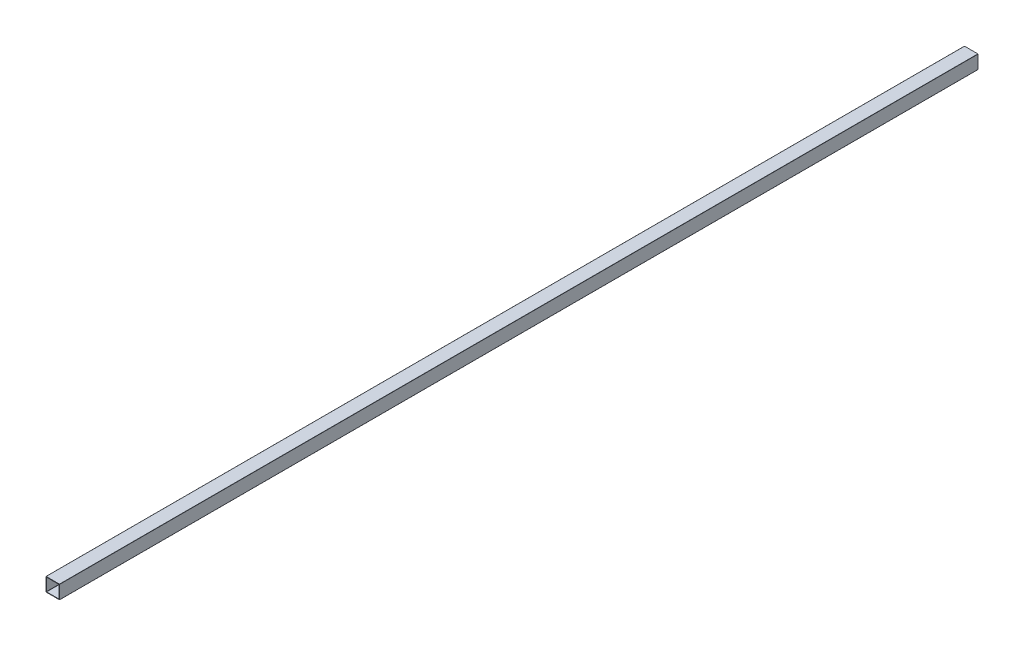
ISO-10303-21;
HEADER;
FILE_DESCRIPTION(('STEP AP214'),'2;1');
FILE_NAME('part.step','',(''),(''),'','','');
FILE_SCHEMA(('AUTOMOTIVE_DESIGN { 1 0 10303 214 1 1 1 1 }'));
ENDSEC;
DATA;
#1=APPLICATION_CONTEXT('core data for automotive mechanical design processes');
#2=APPLICATION_PROTOCOL_DEFINITION('international standard','automotive_design',2000,#1);
#3=PRODUCT_CONTEXT('',#1,'mechanical');
#4=PRODUCT('Part','Part','',(#3));
#5=PRODUCT_RELATED_PRODUCT_CATEGORY('part','',(#4));
#6=PRODUCT_DEFINITION_FORMATION('','',#4);
#7=PRODUCT_DEFINITION_CONTEXT('part definition',#1,'design');
#8=PRODUCT_DEFINITION('design','',#6,#7);
#9=PRODUCT_DEFINITION_SHAPE('','',#8);
#10=(LENGTH_UNIT() NAMED_UNIT(*) SI_UNIT(.MILLI.,.METRE.));
#11=(NAMED_UNIT(*) PLANE_ANGLE_UNIT() SI_UNIT($,.RADIAN.));
#12=(NAMED_UNIT(*) SI_UNIT($,.STERADIAN.) SOLID_ANGLE_UNIT());
#13=UNCERTAINTY_MEASURE_WITH_UNIT(LENGTH_MEASURE(1.E-05),#10,'distance_accuracy_value','');
#14=(GEOMETRIC_REPRESENTATION_CONTEXT(3) GLOBAL_UNCERTAINTY_ASSIGNED_CONTEXT((#13)) GLOBAL_UNIT_ASSIGNED_CONTEXT((#10,
#11,#12)) REPRESENTATION_CONTEXT('',''));
#15=CARTESIAN_POINT('',(0.,0.,0.));
#16=DIRECTION('',(0.,0.,1.));
#17=DIRECTION('',(1.,0.,0.));
#18=AXIS2_PLACEMENT_3D('',#15,#16,#17);
#19=CARTESIAN_POINT('',(44.45,-44.45,-6000.));
#20=DIRECTION('',(1.,0.,0.));
#21=DIRECTION('',(0.,0.,-1.));
#22=AXIS2_PLACEMENT_3D('',#19,#20,#21);
#23=PLANE('',#22);
#24=DIRECTION('',(0.,1.,0.));
#25=VECTOR('',#24,1.);
#26=CARTESIAN_POINT('',(44.45,-44.45,0.));
#27=LINE('',#26,#25);
#28=CARTESIAN_POINT('',(44.45,-43.45,0.));
#29=VERTEX_POINT('',#28);
#30=CARTESIAN_POINT('',(44.45,43.45,0.));
#31=VERTEX_POINT('',#30);
#32=EDGE_CURVE('E197',#29,#31,#27,.T.);
#33=ORIENTED_EDGE('',*,*,#32,.F.);
#34=DIRECTION('',(0.,0.,1.));
#35=VECTOR('',#34,1.);
#36=CARTESIAN_POINT('',(44.45,-43.45,-6000.));
#37=LINE('',#36,#35);
#38=CARTESIAN_POINT('',(44.45,-43.45,-6000.));
#39=VERTEX_POINT('',#38);
#40=EDGE_CURVE('E158',#29,#39,#37,.F.);
#41=ORIENTED_EDGE('',*,*,#40,.T.);
#42=DIRECTION('',(0.,1.,0.));
#43=VECTOR('',#42,1.);
#44=CARTESIAN_POINT('',(44.45,-44.45,-6000.));
#45=LINE('',#44,#43);
#46=CARTESIAN_POINT('',(44.45,43.45,-6000.));
#47=VERTEX_POINT('',#46);
#48=EDGE_CURVE('E185',#39,#47,#45,.T.);
#49=ORIENTED_EDGE('',*,*,#48,.T.);
#50=DIRECTION('',(0.,0.,1.));
#51=VECTOR('',#50,1.);
#52=CARTESIAN_POINT('',(44.45,43.45,-6000.));
#53=LINE('',#52,#51);
#54=EDGE_CURVE('E251',#47,#31,#53,.T.);
#55=ORIENTED_EDGE('',*,*,#54,.T.);
#56=EDGE_LOOP('',(#33,#41,#49,#55));
#57=FACE_BOUND('',#56,.T.);
#58=ADVANCED_FACE('F33',(#57),#23,.T.);
#59=CARTESIAN_POINT('',(-44.45,-44.45,-6000.));
#60=DIRECTION('',(0.,-1.,0.));
#61=DIRECTION('',(0.,0.,-1.));
#62=AXIS2_PLACEMENT_3D('',#59,#60,#61);
#63=PLANE('',#62);
#64=DIRECTION('',(1.,0.,0.));
#65=VECTOR('',#64,1.);
#66=CARTESIAN_POINT('',(-44.45,-44.45,0.));
#67=LINE('',#66,#65);
#68=CARTESIAN_POINT('',(-43.45,-44.45,0.));
#69=VERTEX_POINT('',#68);
#70=CARTESIAN_POINT('',(43.45,-44.45,0.));
#71=VERTEX_POINT('',#70);
#72=EDGE_CURVE('E189',#69,#71,#67,.T.);
#73=ORIENTED_EDGE('',*,*,#72,.F.);
#74=DIRECTION('',(0.,0.,1.));
#75=VECTOR('',#74,1.);
#76=CARTESIAN_POINT('',(-43.45,-44.45,-6000.));
#77=LINE('',#76,#75);
#78=CARTESIAN_POINT('',(-43.45,-44.45,-6000.));
#79=VERTEX_POINT('',#78);
#80=EDGE_CURVE('E238',#69,#79,#77,.F.);
#81=ORIENTED_EDGE('',*,*,#80,.T.);
#82=DIRECTION('',(1.,0.,0.));
#83=VECTOR('',#82,1.);
#84=CARTESIAN_POINT('',(-44.45,-44.45,-6000.));
#85=LINE('',#84,#83);
#86=CARTESIAN_POINT('',(43.45,-44.45,-6000.));
#87=VERTEX_POINT('',#86);
#88=EDGE_CURVE('E194',#79,#87,#85,.T.);
#89=ORIENTED_EDGE('',*,*,#88,.T.);
#90=DIRECTION('',(0.,0.,1.));
#91=VECTOR('',#90,1.);
#92=CARTESIAN_POINT('',(43.45,-44.45,-6000.));
#93=LINE('',#92,#91);
#94=EDGE_CURVE('E235',#87,#71,#93,.T.);
#95=ORIENTED_EDGE('',*,*,#94,.T.);
#96=EDGE_LOOP('',(#73,#81,#89,#95));
#97=FACE_BOUND('',#96,.T.);
#98=ADVANCED_FACE('F305',(#97),#63,.T.);
#99=CARTESIAN_POINT('',(-44.45,-44.45,-6000.));
#100=DIRECTION('',(-1.,0.,0.));
#101=DIRECTION('',(0.,0.,1.));
#102=AXIS2_PLACEMENT_3D('',#99,#100,#101);
#103=PLANE('',#102);
#104=DIRECTION('',(0.,-1.,0.));
#105=VECTOR('',#104,1.);
#106=CARTESIAN_POINT('',(-44.45,-44.45,-6000.));
#107=LINE('',#106,#105);
#108=CARTESIAN_POINT('',(-44.45,43.45,-6000.));
#109=VERTEX_POINT('',#108);
#110=CARTESIAN_POINT('',(-44.45,-43.45,-6000.));
#111=VERTEX_POINT('',#110);
#112=EDGE_CURVE('E191',#109,#111,#107,.T.);
#113=ORIENTED_EDGE('',*,*,#112,.T.);
#114=DIRECTION('',(0.,0.,1.));
#115=VECTOR('',#114,1.);
#116=CARTESIAN_POINT('',(-44.45,-43.45,-6000.));
#117=LINE('',#116,#115);
#118=CARTESIAN_POINT('',(-44.45,-43.45,0.));
#119=VERTEX_POINT('',#118);
#120=EDGE_CURVE('E224',#111,#119,#117,.T.);
#121=ORIENTED_EDGE('',*,*,#120,.T.);
#122=DIRECTION('',(0.,-1.,0.));
#123=VECTOR('',#122,1.);
#124=CARTESIAN_POINT('',(-44.45,-44.45,0.));
#125=LINE('',#124,#123);
#126=CARTESIAN_POINT('',(-44.45,43.45,0.));
#127=VERTEX_POINT('',#126);
#128=EDGE_CURVE('E203',#127,#119,#125,.T.);
#129=ORIENTED_EDGE('',*,*,#128,.F.);
#130=DIRECTION('',(0.,0.,1.));
#131=VECTOR('',#130,1.);
#132=CARTESIAN_POINT('',(-44.45,43.45,-6000.));
#133=LINE('',#132,#131);
#134=EDGE_CURVE('E222',#127,#109,#133,.F.);
#135=ORIENTED_EDGE('',*,*,#134,.T.);
#136=EDGE_LOOP('',(#113,#121,#129,#135));
#137=FACE_BOUND('',#136,.T.);
#138=ADVANCED_FACE('F311',(#137),#103,.T.);
#139=CARTESIAN_POINT('',(-44.45,44.45,-6000.));
#140=DIRECTION('',(0.,1.,0.));
#141=DIRECTION('',(0.,0.,1.));
#142=AXIS2_PLACEMENT_3D('',#139,#140,#141);
#143=PLANE('',#142);
#144=DIRECTION('',(-1.,0.,0.));
#145=VECTOR('',#144,1.);
#146=CARTESIAN_POINT('',(-44.45,44.45,-6000.));
#147=LINE('',#146,#145);
#148=CARTESIAN_POINT('',(43.45,44.45,-6000.));
#149=VERTEX_POINT('',#148);
#150=CARTESIAN_POINT('',(-43.45,44.45,-6000.));
#151=VERTEX_POINT('',#150);
#152=EDGE_CURVE('E188',#149,#151,#147,.T.);
#153=ORIENTED_EDGE('',*,*,#152,.T.);
#154=DIRECTION('',(0.,0.,1.));
#155=VECTOR('',#154,1.);
#156=CARTESIAN_POINT('',(-43.45,44.45,-6000.));
#157=LINE('',#156,#155);
#158=CARTESIAN_POINT('',(-43.45,44.45,0.));
#159=VERTEX_POINT('',#158);
#160=EDGE_CURVE('E248',#151,#159,#157,.T.);
#161=ORIENTED_EDGE('',*,*,#160,.T.);
#162=DIRECTION('',(-1.,0.,0.));
#163=VECTOR('',#162,1.);
#164=CARTESIAN_POINT('',(-44.45,44.45,0.));
#165=LINE('',#164,#163);
#166=CARTESIAN_POINT('',(43.45,44.45,0.));
#167=VERTEX_POINT('',#166);
#168=EDGE_CURVE('E200',#167,#159,#165,.T.);
#169=ORIENTED_EDGE('',*,*,#168,.F.);
#170=DIRECTION('',(0.,0.,1.));
#171=VECTOR('',#170,1.);
#172=CARTESIAN_POINT('',(43.45,44.45,-6000.));
#173=LINE('',#172,#171);
#174=EDGE_CURVE('E55',#167,#149,#173,.F.);
#175=ORIENTED_EDGE('',*,*,#174,.T.);
#176=EDGE_LOOP('',(#153,#161,#169,#175));
#177=FACE_BOUND('',#176,.T.);
#178=ADVANCED_FACE('F316',(#177),#143,.T.);
#179=CARTESIAN_POINT('',(0.,0.,-6000.));
#180=DIRECTION('',(0.,0.,-1.));
#181=DIRECTION('',(-1.,0.,0.));
#182=AXIS2_PLACEMENT_3D('',#179,#180,#181);
#183=PLANE('',#182);
#184=DIRECTION('',(0.,-1.,0.));
#185=VECTOR('',#184,1.);
#186=CARTESIAN_POINT('',(-41.41,-41.41,-6000.));
#187=LINE('',#186,#185);
#188=CARTESIAN_POINT('',(-41.41,40.41,-6000.));
#189=VERTEX_POINT('',#188);
#190=CARTESIAN_POINT('',(-41.41,-40.41,-6000.));
#191=VERTEX_POINT('',#190);
#192=EDGE_CURVE('E167',#189,#191,#187,.T.);
#193=ORIENTED_EDGE('',*,*,#192,.T.);
#194=CARTESIAN_POINT('',(-40.41,-40.41,-6000.));
#195=DIRECTION('',(0.,0.,-1.));
#196=DIRECTION('',(-1.,0.,0.));
#197=AXIS2_PLACEMENT_3D('',#194,#195,#196);
#198=CIRCLE('',#197,1.);
#199=CARTESIAN_POINT('',(-40.41,-41.41,-6000.));
#200=VERTEX_POINT('',#199);
#201=EDGE_CURVE('E11',#191,#200,#198,.F.);
#202=ORIENTED_EDGE('',*,*,#201,.T.);
#203=DIRECTION('',(1.,0.,0.));
#204=VECTOR('',#203,1.);
#205=CARTESIAN_POINT('',(-41.41,-41.41,-6000.));
#206=LINE('',#205,#204);
#207=CARTESIAN_POINT('',(40.41,-41.41,-6000.));
#208=VERTEX_POINT('',#207);
#209=EDGE_CURVE('E175',#200,#208,#206,.T.);
#210=ORIENTED_EDGE('',*,*,#209,.T.);
#211=CARTESIAN_POINT('',(40.41,-40.41,-6000.));
#212=DIRECTION('',(0.,0.,-1.));
#213=DIRECTION('',(-1.,0.,0.));
#214=AXIS2_PLACEMENT_3D('',#211,#212,#213);
#215=CIRCLE('',#214,1.);
#216=CARTESIAN_POINT('',(41.41,-40.41,-6000.));
#217=VERTEX_POINT('',#216);
#218=EDGE_CURVE('E262',#208,#217,#215,.F.);
#219=ORIENTED_EDGE('',*,*,#218,.T.);
#220=DIRECTION('',(0.,1.,0.));
#221=VECTOR('',#220,1.);
#222=CARTESIAN_POINT('',(41.41,-41.41,-6000.));
#223=LINE('',#222,#221);
#224=CARTESIAN_POINT('',(41.41,40.41,-6000.));
#225=VERTEX_POINT('',#224);
#226=EDGE_CURVE('E179',#217,#225,#223,.T.);
#227=ORIENTED_EDGE('',*,*,#226,.T.);
#228=CARTESIAN_POINT('',(40.41,40.41,-6000.));
#229=DIRECTION('',(0.,0.,-1.));
#230=DIRECTION('',(-1.,0.,0.));
#231=AXIS2_PLACEMENT_3D('',#228,#229,#230);
#232=CIRCLE('',#231,1.);
#233=CARTESIAN_POINT('',(40.41,41.41,-6000.));
#234=VERTEX_POINT('',#233);
#235=EDGE_CURVE('E258',#225,#234,#232,.F.);
#236=ORIENTED_EDGE('',*,*,#235,.T.);
#237=DIRECTION('',(-1.,0.,0.));
#238=VECTOR('',#237,1.);
#239=CARTESIAN_POINT('',(-41.41,41.41,-6000.));
#240=LINE('',#239,#238);
#241=CARTESIAN_POINT('',(-40.41,41.41,-6000.));
#242=VERTEX_POINT('',#241);
#243=EDGE_CURVE('E277',#234,#242,#240,.T.);
#244=ORIENTED_EDGE('',*,*,#243,.T.);
#245=CARTESIAN_POINT('',(-40.41,40.41,-6000.));
#246=DIRECTION('',(0.,0.,-1.));
#247=DIRECTION('',(-1.,0.,0.));
#248=AXIS2_PLACEMENT_3D('',#245,#246,#247);
#249=CIRCLE('',#248,1.);
#250=EDGE_CURVE('E157',#242,#189,#249,.F.);
#251=ORIENTED_EDGE('',*,*,#250,.T.);
#252=EDGE_LOOP('',(#193,#202,#210,#219,#227,#236,#244,#251));
#253=FACE_BOUND('',#252,.T.);
#254=ORIENTED_EDGE('',*,*,#88,.F.);
#255=CARTESIAN_POINT('',(-43.45,-43.45,-6000.));
#256=DIRECTION('',(0.,0.,-1.));
#257=DIRECTION('',(-1.,0.,0.));
#258=AXIS2_PLACEMENT_3D('',#255,#256,#257);
#259=CIRCLE('',#258,1.);
#260=EDGE_CURVE('E245',#79,#111,#259,.T.);
#261=ORIENTED_EDGE('',*,*,#260,.T.);
#262=ORIENTED_EDGE('',*,*,#112,.F.);
#263=CARTESIAN_POINT('',(-43.45,43.45,-6000.));
#264=DIRECTION('',(0.,0.,-1.));
#265=DIRECTION('',(-1.,0.,0.));
#266=AXIS2_PLACEMENT_3D('',#263,#264,#265);
#267=CIRCLE('',#266,1.);
#268=EDGE_CURVE('E48',#109,#151,#267,.T.);
#269=ORIENTED_EDGE('',*,*,#268,.T.);
#270=ORIENTED_EDGE('',*,*,#152,.F.);
#271=CARTESIAN_POINT('',(43.45,43.45,-6000.));
#272=DIRECTION('',(0.,0.,-1.));
#273=DIRECTION('',(-1.,0.,0.));
#274=AXIS2_PLACEMENT_3D('',#271,#272,#273);
#275=CIRCLE('',#274,1.);
#276=EDGE_CURVE('E240',#149,#47,#275,.T.);
#277=ORIENTED_EDGE('',*,*,#276,.T.);
#278=ORIENTED_EDGE('',*,*,#48,.F.);
#279=CARTESIAN_POINT('',(43.45,-43.45,-6000.));
#280=DIRECTION('',(0.,0.,-1.));
#281=DIRECTION('',(-1.,0.,0.));
#282=AXIS2_PLACEMENT_3D('',#279,#280,#281);
#283=CIRCLE('',#282,1.);
#284=EDGE_CURVE('E242',#39,#87,#283,.T.);
#285=ORIENTED_EDGE('',*,*,#284,.T.);
#286=EDGE_LOOP('',(#254,#261,#262,#269,#270,#277,#278,#285));
#287=FACE_BOUND('',#286,.T.);
#288=ADVANCED_FACE('F267',(#253,#287),#183,.T.);
#289=CARTESIAN_POINT('',(0.,0.,0.));
#290=DIRECTION('',(0.,0.,-1.));
#291=DIRECTION('',(-1.,0.,0.));
#292=AXIS2_PLACEMENT_3D('',#289,#290,#291);
#293=PLANE('',#292);
#294=DIRECTION('',(0.,1.,0.));
#295=VECTOR('',#294,1.);
#296=CARTESIAN_POINT('',(41.41,-41.41,0.));
#297=LINE('',#296,#295);
#298=CARTESIAN_POINT('',(41.41,-40.41,0.));
#299=VERTEX_POINT('',#298);
#300=CARTESIAN_POINT('',(41.41,40.41,0.));
#301=VERTEX_POINT('',#300);
#302=EDGE_CURVE('E181',#299,#301,#297,.T.);
#303=ORIENTED_EDGE('',*,*,#302,.F.);
#304=CARTESIAN_POINT('',(40.41,-40.41,0.));
#305=DIRECTION('',(0.,0.,-1.));
#306=DIRECTION('',(-1.,0.,0.));
#307=AXIS2_PLACEMENT_3D('',#304,#305,#306);
#308=CIRCLE('',#307,1.);
#309=CARTESIAN_POINT('',(40.41,-41.41,0.));
#310=VERTEX_POINT('',#309);
#311=EDGE_CURVE('E260',#299,#310,#308,.T.);
#312=ORIENTED_EDGE('',*,*,#311,.T.);
#313=DIRECTION('',(1.,0.,0.));
#314=VECTOR('',#313,1.);
#315=CARTESIAN_POINT('',(-41.41,-41.41,0.));
#316=LINE('',#315,#314);
#317=CARTESIAN_POINT('',(-40.41,-41.41,0.));
#318=VERTEX_POINT('',#317);
#319=EDGE_CURVE('E281',#318,#310,#316,.T.);
#320=ORIENTED_EDGE('',*,*,#319,.F.);
#321=CARTESIAN_POINT('',(-40.41,-40.41,0.));
#322=DIRECTION('',(0.,0.,-1.));
#323=DIRECTION('',(-1.,0.,0.));
#324=AXIS2_PLACEMENT_3D('',#321,#322,#323);
#325=CIRCLE('',#324,1.);
#326=CARTESIAN_POINT('',(-41.41,-40.41,0.));
#327=VERTEX_POINT('',#326);
#328=EDGE_CURVE('E41',#318,#327,#325,.T.);
#329=ORIENTED_EDGE('',*,*,#328,.T.);
#330=DIRECTION('',(0.,-1.,0.));
#331=VECTOR('',#330,1.);
#332=CARTESIAN_POINT('',(-41.41,-41.41,0.));
#333=LINE('',#332,#331);
#334=CARTESIAN_POINT('',(-41.41,40.41,0.));
#335=VERTEX_POINT('',#334);
#336=EDGE_CURVE('E164',#335,#327,#333,.T.);
#337=ORIENTED_EDGE('',*,*,#336,.F.);
#338=CARTESIAN_POINT('',(-40.41,40.41,0.));
#339=DIRECTION('',(0.,0.,-1.));
#340=DIRECTION('',(-1.,0.,0.));
#341=AXIS2_PLACEMENT_3D('',#338,#339,#340);
#342=CIRCLE('',#341,1.);
#343=CARTESIAN_POINT('',(-40.41,41.41,0.));
#344=VERTEX_POINT('',#343);
#345=EDGE_CURVE('E147',#335,#344,#342,.T.);
#346=ORIENTED_EDGE('',*,*,#345,.T.);
#347=DIRECTION('',(-1.,0.,0.));
#348=VECTOR('',#347,1.);
#349=CARTESIAN_POINT('',(-41.41,41.41,0.));
#350=LINE('',#349,#348);
#351=CARTESIAN_POINT('',(40.41,41.41,0.));
#352=VERTEX_POINT('',#351);
#353=EDGE_CURVE('E176',#352,#344,#350,.T.);
#354=ORIENTED_EDGE('',*,*,#353,.F.);
#355=CARTESIAN_POINT('',(40.41,40.41,0.));
#356=DIRECTION('',(0.,0.,-1.));
#357=DIRECTION('',(-1.,0.,0.));
#358=AXIS2_PLACEMENT_3D('',#355,#356,#357);
#359=CIRCLE('',#358,1.);
#360=EDGE_CURVE('E256',#352,#301,#359,.T.);
#361=ORIENTED_EDGE('',*,*,#360,.T.);
#362=EDGE_LOOP('',(#303,#312,#320,#329,#337,#346,#354,#361));
#363=FACE_BOUND('',#362,.T.);
#364=ORIENTED_EDGE('',*,*,#128,.T.);
#365=CARTESIAN_POINT('',(-43.45,-43.45,0.));
#366=DIRECTION('',(0.,0.,-1.));
#367=DIRECTION('',(-1.,0.,0.));
#368=AXIS2_PLACEMENT_3D('',#365,#366,#367);
#369=CIRCLE('',#368,1.);
#370=EDGE_CURVE('E233',#119,#69,#369,.F.);
#371=ORIENTED_EDGE('',*,*,#370,.T.);
#372=ORIENTED_EDGE('',*,*,#72,.T.);
#373=CARTESIAN_POINT('',(43.45,-43.45,0.));
#374=DIRECTION('',(0.,0.,-1.));
#375=DIRECTION('',(-1.,0.,0.));
#376=AXIS2_PLACEMENT_3D('',#373,#374,#375);
#377=CIRCLE('',#376,1.);
#378=EDGE_CURVE('E229',#71,#29,#377,.F.);
#379=ORIENTED_EDGE('',*,*,#378,.T.);
#380=ORIENTED_EDGE('',*,*,#32,.T.);
#381=CARTESIAN_POINT('',(43.45,43.45,0.));
#382=DIRECTION('',(0.,0.,-1.));
#383=DIRECTION('',(-1.,0.,0.));
#384=AXIS2_PLACEMENT_3D('',#381,#382,#383);
#385=CIRCLE('',#384,1.);
#386=EDGE_CURVE('E227',#31,#167,#385,.F.);
#387=ORIENTED_EDGE('',*,*,#386,.T.);
#388=ORIENTED_EDGE('',*,*,#168,.T.);
#389=CARTESIAN_POINT('',(-43.45,43.45,0.));
#390=DIRECTION('',(0.,0.,-1.));
#391=DIRECTION('',(-1.,0.,0.));
#392=AXIS2_PLACEMENT_3D('',#389,#390,#391);
#393=CIRCLE('',#392,1.);
#394=EDGE_CURVE('E231',#159,#127,#393,.F.);
#395=ORIENTED_EDGE('',*,*,#394,.T.);
#396=EDGE_LOOP('',(#364,#371,#372,#379,#380,#387,#388,#395));
#397=FACE_BOUND('',#396,.T.);
#398=ADVANCED_FACE('F172',(#363,#397),#293,.F.);
#399=CARTESIAN_POINT('',(-41.41,-41.41,-6000.));
#400=DIRECTION('',(0.,-1.,0.));
#401=DIRECTION('',(0.,0.,-1.));
#402=AXIS2_PLACEMENT_3D('',#399,#400,#401);
#403=PLANE('',#402);
#404=ORIENTED_EDGE('',*,*,#319,.T.);
#405=DIRECTION('',(0.,0.,1.));
#406=VECTOR('',#405,1.);
#407=CARTESIAN_POINT('',(40.41,-41.41,-6000.));
#408=LINE('',#407,#406);
#409=EDGE_CURVE('E220',#310,#208,#408,.F.);
#410=ORIENTED_EDGE('',*,*,#409,.T.);
#411=ORIENTED_EDGE('',*,*,#209,.F.);
#412=DIRECTION('',(0.,0.,1.));
#413=VECTOR('',#412,1.);
#414=CARTESIAN_POINT('',(-40.41,-41.41,0.));
#415=LINE('',#414,#413);
#416=EDGE_CURVE('E217',#200,#318,#415,.T.);
#417=ORIENTED_EDGE('',*,*,#416,.T.);
#418=EDGE_LOOP('',(#404,#410,#411,#417));
#419=FACE_BOUND('',#418,.T.);
#420=ADVANCED_FACE('F283',(#419),#403,.F.);
#421=CARTESIAN_POINT('',(-41.41,-41.41,-6000.));
#422=DIRECTION('',(-1.,0.,0.));
#423=DIRECTION('',(0.,0.,1.));
#424=AXIS2_PLACEMENT_3D('',#421,#422,#423);
#425=PLANE('',#424);
#426=ORIENTED_EDGE('',*,*,#192,.F.);
#427=DIRECTION('',(0.,0.,1.));
#428=VECTOR('',#427,1.);
#429=CARTESIAN_POINT('',(-41.41,40.41,0.));
#430=LINE('',#429,#428);
#431=EDGE_CURVE('E151',#189,#335,#430,.T.);
#432=ORIENTED_EDGE('',*,*,#431,.T.);
#433=ORIENTED_EDGE('',*,*,#336,.T.);
#434=DIRECTION('',(0.,0.,1.));
#435=VECTOR('',#434,1.);
#436=CARTESIAN_POINT('',(-41.41,-40.41,-6000.));
#437=LINE('',#436,#435);
#438=EDGE_CURVE('E169',#327,#191,#437,.F.);
#439=ORIENTED_EDGE('',*,*,#438,.T.);
#440=EDGE_LOOP('',(#426,#432,#433,#439));
#441=FACE_BOUND('',#440,.T.);
#442=ADVANCED_FACE('F163',(#441),#425,.F.);
#443=CARTESIAN_POINT('',(-41.41,41.41,-6000.));
#444=DIRECTION('',(0.,1.,0.));
#445=DIRECTION('',(-1.,0.,0.));
#446=AXIS2_PLACEMENT_3D('',#443,#444,#445);
#447=PLANE('',#446);
#448=ORIENTED_EDGE('',*,*,#353,.T.);
#449=DIRECTION('',(0.,0.,1.));
#450=VECTOR('',#449,1.);
#451=CARTESIAN_POINT('',(-40.41,41.41,-6000.));
#452=LINE('',#451,#450);
#453=EDGE_CURVE('E152',#344,#242,#452,.F.);
#454=ORIENTED_EDGE('',*,*,#453,.T.);
#455=ORIENTED_EDGE('',*,*,#243,.F.);
#456=DIRECTION('',(0.,0.,1.));
#457=VECTOR('',#456,1.);
#458=CARTESIAN_POINT('',(40.41,41.41,0.));
#459=LINE('',#458,#457);
#460=EDGE_CURVE('E168',#234,#352,#459,.T.);
#461=ORIENTED_EDGE('',*,*,#460,.T.);
#462=EDGE_LOOP('',(#448,#454,#455,#461));
#463=FACE_BOUND('',#462,.T.);
#464=ADVANCED_FACE('F292',(#463),#447,.F.);
#465=CARTESIAN_POINT('',(41.41,-41.41,-6000.));
#466=DIRECTION('',(1.,0.,0.));
#467=DIRECTION('',(0.,1.,0.));
#468=AXIS2_PLACEMENT_3D('',#465,#466,#467);
#469=PLANE('',#468);
#470=ORIENTED_EDGE('',*,*,#302,.T.);
#471=DIRECTION('',(0.,0.,1.));
#472=VECTOR('',#471,1.);
#473=CARTESIAN_POINT('',(41.41,40.41,-6000.));
#474=LINE('',#473,#472);
#475=EDGE_CURVE('E215',#301,#225,#474,.F.);
#476=ORIENTED_EDGE('',*,*,#475,.T.);
#477=ORIENTED_EDGE('',*,*,#226,.F.);
#478=DIRECTION('',(0.,0.,1.));
#479=VECTOR('',#478,1.);
#480=CARTESIAN_POINT('',(41.41,-40.41,0.));
#481=LINE('',#480,#479);
#482=EDGE_CURVE('E212',#217,#299,#481,.T.);
#483=ORIENTED_EDGE('',*,*,#482,.T.);
#484=EDGE_LOOP('',(#470,#476,#477,#483));
#485=FACE_BOUND('',#484,.T.);
#486=ADVANCED_FACE('F275',(#485),#469,.F.);
#487=CARTESIAN_POINT('',(-40.41,40.41,-6000.));
#488=DIRECTION('',(0.,0.,-1.));
#489=DIRECTION('',(-1.,0.,0.));
#490=AXIS2_PLACEMENT_3D('',#487,#488,#489);
#491=CYLINDRICAL_SURFACE('',#490,1.);
#492=ORIENTED_EDGE('',*,*,#250,.F.);
#493=ORIENTED_EDGE('',*,*,#453,.F.);
#494=ORIENTED_EDGE('',*,*,#345,.F.);
#495=ORIENTED_EDGE('',*,*,#431,.F.);
#496=EDGE_LOOP('',(#492,#493,#494,#495));
#497=FACE_BOUND('',#496,.T.);
#498=ADVANCED_FACE('F150',(#497),#491,.F.);
#499=CARTESIAN_POINT('',(40.41,40.41,-6000.));
#500=DIRECTION('',(0.,0.,-1.));
#501=DIRECTION('',(-1.,0.,0.));
#502=AXIS2_PLACEMENT_3D('',#499,#500,#501);
#503=CYLINDRICAL_SURFACE('',#502,1.);
#504=ORIENTED_EDGE('',*,*,#235,.F.);
#505=ORIENTED_EDGE('',*,*,#475,.F.);
#506=ORIENTED_EDGE('',*,*,#360,.F.);
#507=ORIENTED_EDGE('',*,*,#460,.F.);
#508=EDGE_LOOP('',(#504,#505,#506,#507));
#509=FACE_BOUND('',#508,.T.);
#510=ADVANCED_FACE('F294',(#509),#503,.F.);
#511=CARTESIAN_POINT('',(40.41,-40.41,-6000.));
#512=DIRECTION('',(0.,0.,-1.));
#513=DIRECTION('',(-1.,0.,0.));
#514=AXIS2_PLACEMENT_3D('',#511,#512,#513);
#515=CYLINDRICAL_SURFACE('',#514,1.);
#516=ORIENTED_EDGE('',*,*,#218,.F.);
#517=ORIENTED_EDGE('',*,*,#409,.F.);
#518=ORIENTED_EDGE('',*,*,#311,.F.);
#519=ORIENTED_EDGE('',*,*,#482,.F.);
#520=EDGE_LOOP('',(#516,#517,#518,#519));
#521=FACE_BOUND('',#520,.T.);
#522=ADVANCED_FACE('F279',(#521),#515,.F.);
#523=CARTESIAN_POINT('',(-43.45,-43.45,-6000.));
#524=DIRECTION('',(0.,0.,1.));
#525=DIRECTION('',(1.,0.,0.));
#526=AXIS2_PLACEMENT_3D('',#523,#524,#525);
#527=CYLINDRICAL_SURFACE('',#526,1.);
#528=ORIENTED_EDGE('',*,*,#260,.F.);
#529=ORIENTED_EDGE('',*,*,#80,.F.);
#530=ORIENTED_EDGE('',*,*,#370,.F.);
#531=ORIENTED_EDGE('',*,*,#120,.F.);
#532=EDGE_LOOP('',(#528,#529,#530,#531));
#533=FACE_BOUND('',#532,.T.);
#534=ADVANCED_FACE('F301',(#533),#527,.T.);
#535=CARTESIAN_POINT('',(-43.45,43.45,-6000.));
#536=DIRECTION('',(0.,0.,1.));
#537=DIRECTION('',(1.,0.,0.));
#538=AXIS2_PLACEMENT_3D('',#535,#536,#537);
#539=CYLINDRICAL_SURFACE('',#538,1.);
#540=ORIENTED_EDGE('',*,*,#268,.F.);
#541=ORIENTED_EDGE('',*,*,#134,.F.);
#542=ORIENTED_EDGE('',*,*,#394,.F.);
#543=ORIENTED_EDGE('',*,*,#160,.F.);
#544=EDGE_LOOP('',(#540,#541,#542,#543));
#545=FACE_BOUND('',#544,.T.);
#546=ADVANCED_FACE('F368',(#545),#539,.T.);
#547=CARTESIAN_POINT('',(-40.41,-40.41,-6000.));
#548=DIRECTION('',(0.,0.,-1.));
#549=DIRECTION('',(-1.,0.,0.));
#550=AXIS2_PLACEMENT_3D('',#547,#548,#549);
#551=CYLINDRICAL_SURFACE('',#550,1.);
#552=ORIENTED_EDGE('',*,*,#201,.F.);
#553=ORIENTED_EDGE('',*,*,#438,.F.);
#554=ORIENTED_EDGE('',*,*,#328,.F.);
#555=ORIENTED_EDGE('',*,*,#416,.F.);
#556=EDGE_LOOP('',(#552,#553,#554,#555));
#557=FACE_BOUND('',#556,.T.);
#558=ADVANCED_FACE('F378',(#557),#551,.F.);
#559=CARTESIAN_POINT('',(43.45,-43.45,-6000.));
#560=DIRECTION('',(0.,0.,1.));
#561=DIRECTION('',(1.,0.,0.));
#562=AXIS2_PLACEMENT_3D('',#559,#560,#561);
#563=CYLINDRICAL_SURFACE('',#562,1.);
#564=ORIENTED_EDGE('',*,*,#284,.F.);
#565=ORIENTED_EDGE('',*,*,#40,.F.);
#566=ORIENTED_EDGE('',*,*,#378,.F.);
#567=ORIENTED_EDGE('',*,*,#94,.F.);
#568=EDGE_LOOP('',(#564,#565,#566,#567));
#569=FACE_BOUND('',#568,.T.);
#570=ADVANCED_FACE('F388',(#569),#563,.T.);
#571=CARTESIAN_POINT('',(43.45,43.45,-6000.));
#572=DIRECTION('',(0.,0.,1.));
#573=DIRECTION('',(1.,0.,0.));
#574=AXIS2_PLACEMENT_3D('',#571,#572,#573);
#575=CYLINDRICAL_SURFACE('',#574,1.);
#576=ORIENTED_EDGE('',*,*,#276,.F.);
#577=ORIENTED_EDGE('',*,*,#174,.F.);
#578=ORIENTED_EDGE('',*,*,#386,.F.);
#579=ORIENTED_EDGE('',*,*,#54,.F.);
#580=EDGE_LOOP('',(#576,#577,#578,#579));
#581=FACE_BOUND('',#580,.T.);
#582=ADVANCED_FACE('F35',(#581),#575,.T.);
#583=CLOSED_SHELL('',(#58,#98,#138,#178,#288,#398,#420,#442,#464,#486,#498,#510,#522,#534,#546,
#558,#570,#582));
#584=MANIFOLD_SOLID_BREP('B2',#583);
#585=ADVANCED_BREP_SHAPE_REPRESENTATION('',(#18,#584),#14);
#586=SHAPE_DEFINITION_REPRESENTATION(#9,#585);
ENDSEC;
END-ISO-10303-21;
